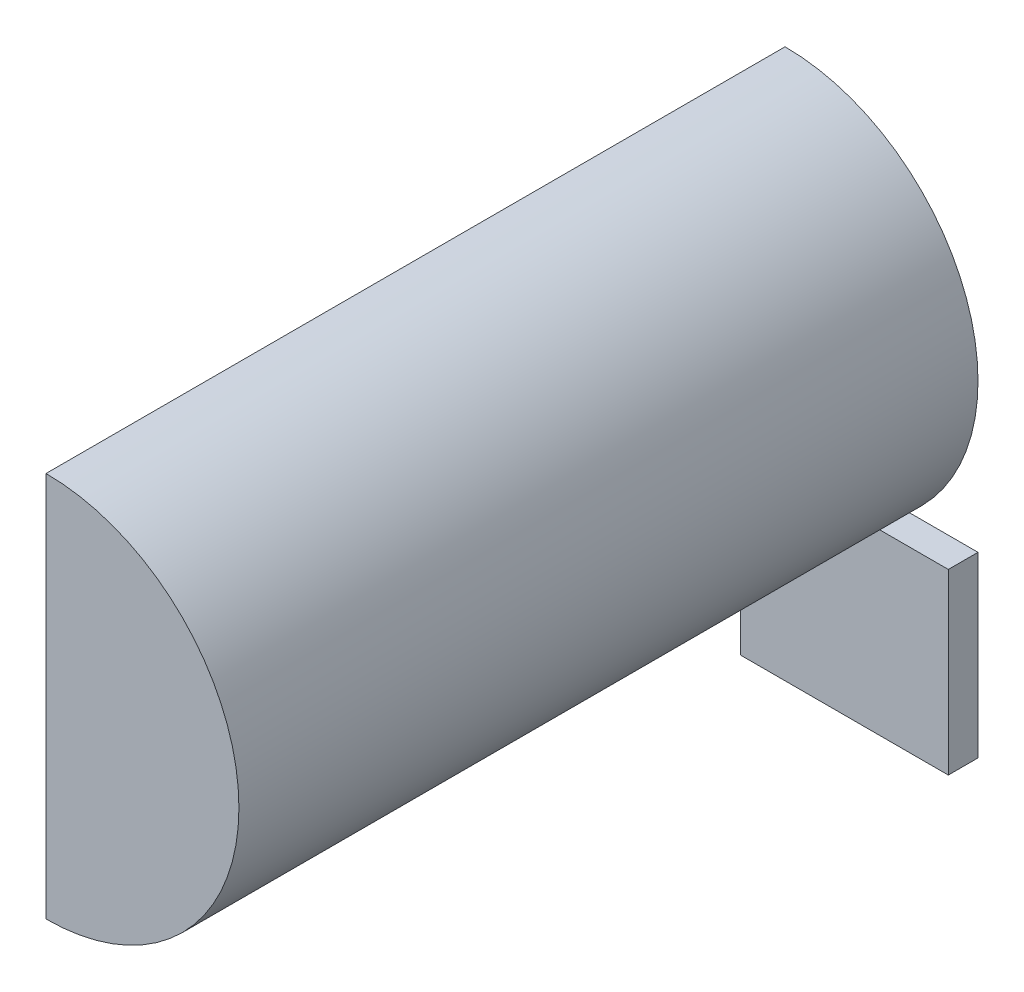
ISO-10303-21;
HEADER;
FILE_DESCRIPTION(('STEP AP214'),'2;1');
FILE_NAME('part.step','',(''),(''),'','','');
FILE_SCHEMA(('AUTOMOTIVE_DESIGN { 1 0 10303 214 1 1 1 1 }'));
ENDSEC;
DATA;
#1=APPLICATION_CONTEXT('core data for automotive mechanical design processes');
#2=APPLICATION_PROTOCOL_DEFINITION('international standard','automotive_design',2000,#1);
#3=PRODUCT_CONTEXT('',#1,'mechanical');
#4=PRODUCT('Part','Part','',(#3));
#5=PRODUCT_RELATED_PRODUCT_CATEGORY('part','',(#4));
#6=PRODUCT_DEFINITION_FORMATION('','',#4);
#7=PRODUCT_DEFINITION_CONTEXT('part definition',#1,'design');
#8=PRODUCT_DEFINITION('design','',#6,#7);
#9=PRODUCT_DEFINITION_SHAPE('','',#8);
#10=(LENGTH_UNIT() NAMED_UNIT(*) SI_UNIT(.MILLI.,.METRE.));
#11=(NAMED_UNIT(*) PLANE_ANGLE_UNIT() SI_UNIT($,.RADIAN.));
#12=(NAMED_UNIT(*) SI_UNIT($,.STERADIAN.) SOLID_ANGLE_UNIT());
#13=UNCERTAINTY_MEASURE_WITH_UNIT(LENGTH_MEASURE(1.E-05),#10,'distance_accuracy_value','');
#14=(GEOMETRIC_REPRESENTATION_CONTEXT(3) GLOBAL_UNCERTAINTY_ASSIGNED_CONTEXT((#13)) GLOBAL_UNIT_ASSIGNED_CONTEXT((#10,
#11,#12)) REPRESENTATION_CONTEXT('',''));
#15=CARTESIAN_POINT('',(0.,0.,0.));
#16=DIRECTION('',(0.,0.,1.));
#17=DIRECTION('',(1.,0.,0.));
#18=AXIS2_PLACEMENT_3D('',#15,#16,#17);
#19=CARTESIAN_POINT('',(70.,-105.,-10.));
#20=DIRECTION('',(-1.,0.,0.));
#21=DIRECTION('',(0.,0.,1.));
#22=AXIS2_PLACEMENT_3D('',#19,#20,#21);
#23=PLANE('',#22);
#24=DIRECTION('',(0.,0.,1.));
#25=VECTOR('',#24,1.);
#26=CARTESIAN_POINT('',(70.,-45.,-10.));
#27=LINE('',#26,#25);
#28=CARTESIAN_POINT('',(70.,-45.,-10.));
#29=VERTEX_POINT('',#28);
#30=CARTESIAN_POINT('',(70.,-45.,0.));
#31=VERTEX_POINT('',#30);
#32=EDGE_CURVE('E116',#29,#31,#27,.T.);
#33=ORIENTED_EDGE('',*,*,#32,.T.);
#34=DIRECTION('',(0.,1.,0.));
#35=VECTOR('',#34,1.);
#36=CARTESIAN_POINT('',(70.,-105.,0.));
#37=LINE('',#36,#35);
#38=CARTESIAN_POINT('',(70.,-105.,0.));
#39=VERTEX_POINT('',#38);
#40=EDGE_CURVE('E12',#39,#31,#37,.T.);
#41=ORIENTED_EDGE('',*,*,#40,.F.);
#42=DIRECTION('',(0.,0.,1.));
#43=VECTOR('',#42,1.);
#44=CARTESIAN_POINT('',(70.,-105.,-10.));
#45=LINE('',#44,#43);
#46=CARTESIAN_POINT('',(70.,-105.,-10.));
#47=VERTEX_POINT('',#46);
#48=EDGE_CURVE('E104',#47,#39,#45,.T.);
#49=ORIENTED_EDGE('',*,*,#48,.F.);
#50=DIRECTION('',(0.,1.,0.));
#51=VECTOR('',#50,1.);
#52=CARTESIAN_POINT('',(70.,-105.,-10.));
#53=LINE('',#52,#51);
#54=EDGE_CURVE('E112',#47,#29,#53,.T.);
#55=ORIENTED_EDGE('',*,*,#54,.T.);
#56=EDGE_LOOP('',(#33,#41,#49,#55));
#57=FACE_BOUND('',#56,.T.);
#58=ADVANCED_FACE('F53',(#57),#23,.F.);
#59=CARTESIAN_POINT('',(70.,-105.,0.));
#60=DIRECTION('',(0.,0.,-1.));
#61=DIRECTION('',(-1.,0.,0.));
#62=AXIS2_PLACEMENT_3D('',#59,#60,#61);
#63=PLANE('',#62);
#64=DIRECTION('',(-1.,0.,0.));
#65=VECTOR('',#64,1.);
#66=CARTESIAN_POINT('',(70.,-45.,0.));
#67=LINE('',#66,#65);
#68=CARTESIAN_POINT('',(0.,-45.,0.));
#69=VERTEX_POINT('',#68);
#70=EDGE_CURVE('E108',#31,#69,#67,.T.);
#71=ORIENTED_EDGE('',*,*,#70,.T.);
#72=DIRECTION('',(0.,1.,0.));
#73=VECTOR('',#72,1.);
#74=CARTESIAN_POINT('',(0.,-105.,0.));
#75=LINE('',#74,#73);
#76=CARTESIAN_POINT('',(0.,-105.,0.));
#77=VERTEX_POINT('',#76);
#78=EDGE_CURVE('E61',#77,#69,#75,.T.);
#79=ORIENTED_EDGE('',*,*,#78,.F.);
#80=DIRECTION('',(-1.,0.,0.));
#81=VECTOR('',#80,1.);
#82=CARTESIAN_POINT('',(70.,-105.,0.));
#83=LINE('',#82,#81);
#84=EDGE_CURVE('E99',#39,#77,#83,.T.);
#85=ORIENTED_EDGE('',*,*,#84,.F.);
#86=ORIENTED_EDGE('',*,*,#40,.T.);
#87=EDGE_LOOP('',(#71,#79,#85,#86));
#88=FACE_BOUND('',#87,.T.);
#89=ADVANCED_FACE('F107',(#88),#63,.F.);
#90=CARTESIAN_POINT('',(0.,-105.,0.));
#91=DIRECTION('',(1.,0.,0.));
#92=DIRECTION('',(0.,0.,-1.));
#93=AXIS2_PLACEMENT_3D('',#90,#91,#92);
#94=PLANE('',#93);
#95=DIRECTION('',(0.,0.,-1.));
#96=VECTOR('',#95,1.);
#97=CARTESIAN_POINT('',(0.,-45.,0.));
#98=LINE('',#97,#96);
#99=CARTESIAN_POINT('',(0.,-45.,-10.));
#100=VERTEX_POINT('',#99);
#101=EDGE_CURVE('E86',#69,#100,#98,.T.);
#102=ORIENTED_EDGE('',*,*,#101,.T.);
#103=DIRECTION('',(0.,1.,0.));
#104=VECTOR('',#103,1.);
#105=CARTESIAN_POINT('',(0.,-105.,-10.));
#106=LINE('',#105,#104);
#107=CARTESIAN_POINT('',(0.,-105.,-10.));
#108=VERTEX_POINT('',#107);
#109=EDGE_CURVE('E109',#108,#100,#106,.T.);
#110=ORIENTED_EDGE('',*,*,#109,.F.);
#111=DIRECTION('',(0.,0.,-1.));
#112=VECTOR('',#111,1.);
#113=CARTESIAN_POINT('',(0.,-105.,0.));
#114=LINE('',#113,#112);
#115=EDGE_CURVE('E102',#77,#108,#114,.T.);
#116=ORIENTED_EDGE('',*,*,#115,.F.);
#117=ORIENTED_EDGE('',*,*,#78,.T.);
#118=EDGE_LOOP('',(#102,#110,#116,#117));
#119=FACE_BOUND('',#118,.T.);
#120=ADVANCED_FACE('F110',(#119),#94,.F.);
#121=CARTESIAN_POINT('',(0.,-105.,-10.));
#122=DIRECTION('',(0.,0.,1.));
#123=DIRECTION('',(1.,0.,0.));
#124=AXIS2_PLACEMENT_3D('',#121,#122,#123);
#125=PLANE('',#124);
#126=DIRECTION('',(1.,0.,0.));
#127=VECTOR('',#126,1.);
#128=CARTESIAN_POINT('',(0.,-45.,-10.));
#129=LINE('',#128,#127);
#130=EDGE_CURVE('E92',#100,#29,#129,.T.);
#131=ORIENTED_EDGE('',*,*,#130,.T.);
#132=ORIENTED_EDGE('',*,*,#54,.F.);
#133=DIRECTION('',(1.,0.,0.));
#134=VECTOR('',#133,1.);
#135=CARTESIAN_POINT('',(0.,-105.,-10.));
#136=LINE('',#135,#134);
#137=EDGE_CURVE('E69',#108,#47,#136,.T.);
#138=ORIENTED_EDGE('',*,*,#137,.F.);
#139=ORIENTED_EDGE('',*,*,#109,.T.);
#140=EDGE_LOOP('',(#131,#132,#138,#139));
#141=FACE_BOUND('',#140,.T.);
#142=ADVANCED_FACE('F123',(#141),#125,.F.);
#143=CARTESIAN_POINT('',(0.,-105.,0.));
#144=DIRECTION('',(0.,-1.,0.));
#145=DIRECTION('',(0.,0.,-1.));
#146=AXIS2_PLACEMENT_3D('',#143,#144,#145);
#147=PLANE('',#146);
#148=ORIENTED_EDGE('',*,*,#48,.T.);
#149=ORIENTED_EDGE('',*,*,#84,.T.);
#150=ORIENTED_EDGE('',*,*,#115,.T.);
#151=ORIENTED_EDGE('',*,*,#137,.T.);
#152=EDGE_LOOP('',(#148,#149,#150,#151));
#153=FACE_BOUND('',#152,.T.);
#154=ADVANCED_FACE('F100',(#153),#147,.T.);
#155=CARTESIAN_POINT('',(0.,-45.,0.));
#156=DIRECTION('',(0.,-1.,0.));
#157=DIRECTION('',(0.,0.,-1.));
#158=AXIS2_PLACEMENT_3D('',#155,#156,#157);
#159=PLANE('',#158);
#160=ORIENTED_EDGE('',*,*,#32,.F.);
#161=ORIENTED_EDGE('',*,*,#130,.F.);
#162=ORIENTED_EDGE('',*,*,#101,.F.);
#163=ORIENTED_EDGE('',*,*,#70,.F.);
#164=EDGE_LOOP('',(#160,#161,#162,#163));
#165=FACE_BOUND('',#164,.T.);
#166=ADVANCED_FACE('F126',(#165),#159,.F.);
#167=CLOSED_SHELL('',(#58,#89,#120,#142,#154,#166));
#168=MANIFOLD_SOLID_BREP('B2',#167);
#169=CARTESIAN_POINT('',(0.,0.,-15.));
#170=DIRECTION('',(0.,0.,1.));
#171=DIRECTION('',(1.,0.,0.));
#172=AXIS2_PLACEMENT_3D('',#169,#170,#171);
#173=CYLINDRICAL_SURFACE('',#172,65.);
#174=CARTESIAN_POINT('',(0.,0.,234.));
#175=DIRECTION('',(0.,0.,1.));
#176=DIRECTION('',(1.,0.,0.));
#177=AXIS2_PLACEMENT_3D('',#174,#175,#176);
#178=CIRCLE('',#177,65.);
#179=CARTESIAN_POINT('',(0.,-65.,234.));
#180=VERTEX_POINT('',#179);
#181=CARTESIAN_POINT('',(0.,65.,234.));
#182=VERTEX_POINT('',#181);
#183=EDGE_CURVE('E235',#180,#182,#178,.T.);
#184=ORIENTED_EDGE('',*,*,#183,.F.);
#185=DIRECTION('',(0.,0.,-1.));
#186=VECTOR('',#185,1.);
#187=CARTESIAN_POINT('',(0.,-65.,-99.6711556595216));
#188=LINE('',#187,#186);
#189=CARTESIAN_POINT('',(0.,-65.,0.));
#190=VERTEX_POINT('',#189);
#191=EDGE_CURVE('E221',#180,#190,#188,.T.);
#192=ORIENTED_EDGE('',*,*,#191,.T.);
#193=CARTESIAN_POINT('',(0.,0.,0.));
#194=DIRECTION('',(0.,0.,1.));
#195=DIRECTION('',(1.,0.,0.));
#196=AXIS2_PLACEMENT_3D('',#193,#194,#195);
#197=CIRCLE('',#196,65.);
#198=CARTESIAN_POINT('',(46.9041575982343,-45.,0.));
#199=VERTEX_POINT('',#198);
#200=EDGE_CURVE('E243',#199,#190,#197,.F.);
#201=ORIENTED_EDGE('',*,*,#200,.F.);
#202=DIRECTION('',(0.,0.,1.));
#203=VECTOR('',#202,1.);
#204=CARTESIAN_POINT('',(46.9041575982343,-45.,-15.));
#205=LINE('',#204,#203);
#206=CARTESIAN_POINT('',(46.9041575982343,-45.,-10.));
#207=VERTEX_POINT('',#206);
#208=EDGE_CURVE('E250',#199,#207,#205,.F.);
#209=ORIENTED_EDGE('',*,*,#208,.T.);
#210=CARTESIAN_POINT('',(0.,0.,-10.));
#211=DIRECTION('',(0.,0.,1.));
#212=DIRECTION('',(1.,0.,0.));
#213=AXIS2_PLACEMENT_3D('',#210,#211,#212);
#214=CIRCLE('',#213,65.);
#215=CARTESIAN_POINT('',(0.,-65.,-9.99999999999999));
#216=VERTEX_POINT('',#215);
#217=EDGE_CURVE('E184',#207,#216,#214,.F.);
#218=ORIENTED_EDGE('',*,*,#217,.T.);
#219=CARTESIAN_POINT('',(0.,-65.,-15.));
#220=VERTEX_POINT('',#219);
#221=EDGE_CURVE('E230',#216,#220,#188,.T.);
#222=ORIENTED_EDGE('',*,*,#221,.T.);
#223=CARTESIAN_POINT('',(0.,0.,-15.));
#224=DIRECTION('',(0.,0.,1.));
#225=DIRECTION('',(1.,0.,0.));
#226=AXIS2_PLACEMENT_3D('',#223,#224,#225);
#227=CIRCLE('',#226,65.);
#228=CARTESIAN_POINT('',(0.,65.,-15.));
#229=VERTEX_POINT('',#228);
#230=EDGE_CURVE('E241',#220,#229,#227,.T.);
#231=ORIENTED_EDGE('',*,*,#230,.T.);
#232=DIRECTION('',(0.,0.,-1.));
#233=VECTOR('',#232,1.);
#234=CARTESIAN_POINT('',(0.,65.,-99.6711556595216));
#235=LINE('',#234,#233);
#236=EDGE_CURVE('E240',#182,#229,#235,.T.);
#237=ORIENTED_EDGE('',*,*,#236,.F.);
#238=EDGE_LOOP('',(#184,#192,#201,#209,#218,#222,#231,#237));
#239=FACE_BOUND('',#238,.T.);
#240=ADVANCED_FACE('F177',(#239),#173,.T.);
#241=CARTESIAN_POINT('',(0.,0.,-15.));
#242=DIRECTION('',(0.,0.,1.));
#243=DIRECTION('',(1.,0.,0.));
#244=AXIS2_PLACEMENT_3D('',#241,#242,#243);
#245=PLANE('',#244);
#246=ORIENTED_EDGE('',*,*,#230,.F.);
#247=DIRECTION('',(0.,1.,0.));
#248=VECTOR('',#247,1.);
#249=CARTESIAN_POINT('',(0.,0.,-15.));
#250=LINE('',#249,#248);
#251=EDGE_CURVE('E236',#220,#229,#250,.T.);
#252=ORIENTED_EDGE('',*,*,#251,.T.);
#253=EDGE_LOOP('',(#246,#252));
#254=FACE_BOUND('',#253,.T.);
#255=ADVANCED_FACE('F274',(#254),#245,.F.);
#256=CARTESIAN_POINT('',(0.,0.,234.));
#257=DIRECTION('',(0.,0.,1.));
#258=DIRECTION('',(1.,0.,0.));
#259=AXIS2_PLACEMENT_3D('',#256,#257,#258);
#260=PLANE('',#259);
#261=DIRECTION('',(0.,1.,0.));
#262=VECTOR('',#261,1.);
#263=CARTESIAN_POINT('',(0.,0.,234.));
#264=LINE('',#263,#262);
#265=EDGE_CURVE('E224',#180,#182,#264,.T.);
#266=ORIENTED_EDGE('',*,*,#265,.F.);
#267=ORIENTED_EDGE('',*,*,#183,.T.);
#268=EDGE_LOOP('',(#266,#267));
#269=FACE_BOUND('',#268,.T.);
#270=ADVANCED_FACE('F234',(#269),#260,.T.);
#271=CARTESIAN_POINT('',(-54.0153658355038,-45.,-10.));
#272=DIRECTION('',(0.,-1.,0.));
#273=DIRECTION('',(0.,0.,-1.));
#274=AXIS2_PLACEMENT_3D('',#271,#272,#273);
#275=PLANE('',#274);
#276=DIRECTION('',(0.,0.,1.));
#277=VECTOR('',#276,1.);
#278=CARTESIAN_POINT('',(0.,-45.,-10.));
#279=LINE('',#278,#277);
#280=CARTESIAN_POINT('',(0.,-45.,-10.));
#281=VERTEX_POINT('',#280);
#282=CARTESIAN_POINT('',(0.,-45.,0.));
#283=VERTEX_POINT('',#282);
#284=EDGE_CURVE('E191',#281,#283,#279,.T.);
#285=ORIENTED_EDGE('',*,*,#284,.F.);
#286=DIRECTION('',(1.,0.,0.));
#287=VECTOR('',#286,1.);
#288=CARTESIAN_POINT('',(-54.0153658355038,-45.,-10.));
#289=LINE('',#288,#287);
#290=EDGE_CURVE('E197',#281,#207,#289,.T.);
#291=ORIENTED_EDGE('',*,*,#290,.T.);
#292=ORIENTED_EDGE('',*,*,#208,.F.);
#293=DIRECTION('',(1.,0.,0.));
#294=VECTOR('',#293,1.);
#295=CARTESIAN_POINT('',(-54.0153658355038,-45.,0.));
#296=LINE('',#295,#294);
#297=EDGE_CURVE('E245',#283,#199,#296,.T.);
#298=ORIENTED_EDGE('',*,*,#297,.F.);
#299=EDGE_LOOP('',(#285,#291,#292,#298));
#300=FACE_BOUND('',#299,.T.);
#301=ADVANCED_FACE('F266',(#300),#275,.T.);
#302=CARTESIAN_POINT('',(0.,0.,-10.));
#303=DIRECTION('',(0.,0.,1.));
#304=DIRECTION('',(1.,0.,0.));
#305=AXIS2_PLACEMENT_3D('',#302,#303,#304);
#306=PLANE('',#305);
#307=DIRECTION('',(0.,1.,0.));
#308=VECTOR('',#307,1.);
#309=CARTESIAN_POINT('',(0.,0.,-10.));
#310=LINE('',#309,#308);
#311=EDGE_CURVE('E237',#216,#281,#310,.T.);
#312=ORIENTED_EDGE('',*,*,#311,.F.);
#313=ORIENTED_EDGE('',*,*,#217,.F.);
#314=ORIENTED_EDGE('',*,*,#290,.F.);
#315=EDGE_LOOP('',(#312,#313,#314));
#316=FACE_BOUND('',#315,.T.);
#317=ADVANCED_FACE('F257',(#316),#306,.T.);
#318=CARTESIAN_POINT('',(0.,0.,0.));
#319=DIRECTION('',(0.,0.,1.));
#320=DIRECTION('',(1.,0.,0.));
#321=AXIS2_PLACEMENT_3D('',#318,#319,#320);
#322=PLANE('',#321);
#323=ORIENTED_EDGE('',*,*,#200,.T.);
#324=DIRECTION('',(0.,1.,0.));
#325=VECTOR('',#324,1.);
#326=CARTESIAN_POINT('',(0.,0.,0.));
#327=LINE('',#326,#325);
#328=EDGE_CURVE('E51',#190,#283,#327,.T.);
#329=ORIENTED_EDGE('',*,*,#328,.T.);
#330=ORIENTED_EDGE('',*,*,#297,.T.);
#331=EDGE_LOOP('',(#323,#329,#330));
#332=FACE_BOUND('',#331,.T.);
#333=ADVANCED_FACE('F265',(#332),#322,.F.);
#334=CARTESIAN_POINT('',(0.,-65.,-99.6711556595216));
#335=DIRECTION('',(1.,0.,0.));
#336=DIRECTION('',(0.,0.,-1.));
#337=AXIS2_PLACEMENT_3D('',#334,#335,#336);
#338=PLANE('',#337);
#339=ORIENTED_EDGE('',*,*,#221,.F.);
#340=ORIENTED_EDGE('',*,*,#311,.T.);
#341=ORIENTED_EDGE('',*,*,#284,.T.);
#342=ORIENTED_EDGE('',*,*,#328,.F.);
#343=ORIENTED_EDGE('',*,*,#191,.F.);
#344=ORIENTED_EDGE('',*,*,#265,.T.);
#345=ORIENTED_EDGE('',*,*,#236,.T.);
#346=ORIENTED_EDGE('',*,*,#251,.F.);
#347=EDGE_LOOP('',(#339,#340,#341,#342,#343,#344,#345,#346));
#348=FACE_BOUND('',#347,.T.);
#349=ADVANCED_FACE('F223',(#348),#338,.F.);
#350=CLOSED_SHELL('',(#240,#255,#270,#301,#317,#333,#349));
#351=MANIFOLD_SOLID_BREP('B6',#350);
#352=ADVANCED_BREP_SHAPE_REPRESENTATION('',(#18,#168,#351),#14);
#353=SHAPE_DEFINITION_REPRESENTATION(#9,#352);
ENDSEC;
END-ISO-10303-21;
